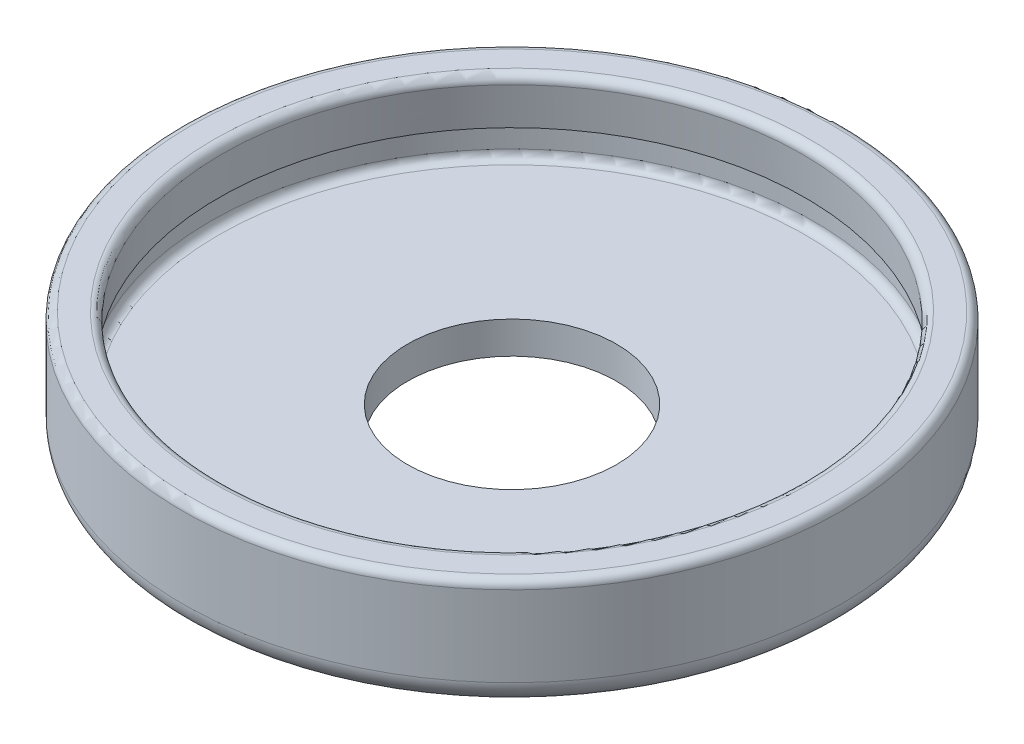
ISO-10303-21;
HEADER;
FILE_DESCRIPTION(('STEP AP214'),'2;1');
FILE_NAME('part.step','',(''),(''),'','','');
FILE_SCHEMA(('AUTOMOTIVE_DESIGN { 1 0 10303 214 1 1 1 1 }'));
ENDSEC;
DATA;
#1=APPLICATION_CONTEXT('core data for automotive mechanical design processes');
#2=APPLICATION_PROTOCOL_DEFINITION('international standard','automotive_design',2000,#1);
#3=PRODUCT_CONTEXT('',#1,'mechanical');
#4=PRODUCT('Part','Part','',(#3));
#5=PRODUCT_RELATED_PRODUCT_CATEGORY('part','',(#4));
#6=PRODUCT_DEFINITION_FORMATION('','',#4);
#7=PRODUCT_DEFINITION_CONTEXT('part definition',#1,'design');
#8=PRODUCT_DEFINITION('design','',#6,#7);
#9=PRODUCT_DEFINITION_SHAPE('','',#8);
#10=(LENGTH_UNIT() NAMED_UNIT(*) SI_UNIT(.MILLI.,.METRE.));
#11=(NAMED_UNIT(*) PLANE_ANGLE_UNIT() SI_UNIT($,.RADIAN.));
#12=(NAMED_UNIT(*) SI_UNIT($,.STERADIAN.) SOLID_ANGLE_UNIT());
#13=UNCERTAINTY_MEASURE_WITH_UNIT(LENGTH_MEASURE(1.E-05),#10,'distance_accuracy_value','');
#14=(GEOMETRIC_REPRESENTATION_CONTEXT(3) GLOBAL_UNCERTAINTY_ASSIGNED_CONTEXT((#13)) GLOBAL_UNIT_ASSIGNED_CONTEXT((#10,
#11,#12)) REPRESENTATION_CONTEXT('',''));
#15=CARTESIAN_POINT('',(0.,0.,0.));
#16=DIRECTION('',(0.,0.,1.));
#17=DIRECTION('',(1.,0.,0.));
#18=AXIS2_PLACEMENT_3D('',#15,#16,#17);
#19=CARTESIAN_POINT('',(0.,1.77799999999998,0.));
#20=DIRECTION('',(0.,1.,0.));
#21=DIRECTION('',(-1.,0.,0.));
#22=AXIS2_PLACEMENT_3D('',#19,#20,#21);
#23=PLANE('',#22);
#24=CARTESIAN_POINT('',(0.,1.77799999999998,0.));
#25=DIRECTION('',(0.,1.,0.));
#26=DIRECTION('',(-1.,0.,0.));
#27=AXIS2_PLACEMENT_3D('',#24,#25,#26);
#28=CIRCLE('',#27,5.08);
#29=CARTESIAN_POINT('',(-5.08000000000001,1.77799999999997,0.));
#30=VERTEX_POINT('',#29);
#31=EDGE_CURVE('E39',#30,#30,#28,.T.);
#32=ORIENTED_EDGE('',*,*,#31,.T.);
#33=EDGE_LOOP('',(#32));
#34=FACE_BOUND('',#33,.T.);
#35=CARTESIAN_POINT('',(0.,1.77799999999998,0.));
#36=DIRECTION('',(0.,1.,0.));
#37=DIRECTION('',(-1.,0.,0.));
#38=AXIS2_PLACEMENT_3D('',#35,#36,#37);
#39=CIRCLE('',#38,4.71002354262556);
#40=CARTESIAN_POINT('',(-4.71002354262556,1.77799999999997,0.));
#41=VERTEX_POINT('',#40);
#42=EDGE_CURVE('E43',#41,#41,#39,.F.);
#43=ORIENTED_EDGE('',*,*,#42,.T.);
#44=EDGE_LOOP('',(#43));
#45=FACE_BOUND('',#44,.T.);
#46=ADVANCED_FACE('F32',(#34,#45),#23,.T.);
#47=CARTESIAN_POINT('',(0.,1.77799999999998,0.));
#48=DIRECTION('',(0.,-1.,0.));
#49=DIRECTION('',(1.,0.,0.));
#50=AXIS2_PLACEMENT_3D('',#47,#48,#49);
#51=CONICAL_SURFACE('',#50,4.57200000000001,0.083141231888437);
#52=CARTESIAN_POINT('',(0.,1.64045322405856,0.));
#53=DIRECTION('',(0.,1.,0.));
#54=DIRECTION('',(-1.,0.,0.));
#55=AXIS2_PLACEMENT_3D('',#52,#53,#54);
#56=CIRCLE('',#55,4.58346223132846);
#57=CARTESIAN_POINT('',(-4.58346223132846,1.64045322405855,0.));
#58=VERTEX_POINT('',#57);
#59=EDGE_CURVE('E10',#58,#58,#56,.T.);
#60=ORIENTED_EDGE('',*,*,#59,.T.);
#61=EDGE_LOOP('',(#60));
#62=FACE_BOUND('',#61,.T.);
#63=CARTESIAN_POINT('',(0.,1.01599999999998,0.));
#64=DIRECTION('',(0.,-1.,0.));
#65=DIRECTION('',(1.,0.,0.));
#66=AXIS2_PLACEMENT_3D('',#63,#64,#65);
#67=CIRCLE('',#66,4.6355);
#68=CARTESIAN_POINT('',(4.6355,1.016,0.));
#69=VERTEX_POINT('',#68);
#70=EDGE_CURVE('E64',#69,#69,#67,.T.);
#71=ORIENTED_EDGE('',*,*,#70,.T.);
#72=EDGE_LOOP('',(#71));
#73=FACE_BOUND('',#72,.T.);
#74=ADVANCED_FACE('F95',(#62,#73),#51,.F.);
#75=CARTESIAN_POINT('',(0.,1.01599999999998,0.));
#76=DIRECTION('',(0.,-1.,0.));
#77=DIRECTION('',(1.,0.,0.));
#78=AXIS2_PLACEMENT_3D('',#75,#76,#77);
#79=PLANE('',#78);
#80=CARTESIAN_POINT('',(0.,1.01599999999998,0.));
#81=DIRECTION('',(0.,-1.,0.));
#82=DIRECTION('',(1.,0.,0.));
#83=AXIS2_PLACEMENT_3D('',#80,#81,#82);
#84=CIRCLE('',#83,4.7625);
#85=CARTESIAN_POINT('',(4.7625,1.016,0.));
#86=VERTEX_POINT('',#85);
#87=EDGE_CURVE('E67',#86,#86,#84,.T.);
#88=ORIENTED_EDGE('',*,*,#87,.T.);
#89=EDGE_LOOP('',(#88));
#90=FACE_BOUND('',#89,.T.);
#91=ORIENTED_EDGE('',*,*,#70,.F.);
#92=EDGE_LOOP('',(#91));
#93=FACE_BOUND('',#92,.T.);
#94=ADVANCED_FACE('F100',(#90,#93),#79,.T.);
#95=CARTESIAN_POINT('',(0.,-1.55045337728563,0.));
#96=DIRECTION('',(0.,-1.,0.));
#97=DIRECTION('',(1.,0.,0.));
#98=AXIS2_PLACEMENT_3D('',#95,#96,#97);
#99=CYLINDRICAL_SURFACE('',#98,4.7625);
#100=CARTESIAN_POINT('',(0.,0.634999999999989,0.));
#101=DIRECTION('',(0.,1.,0.));
#102=DIRECTION('',(-1.,0.,0.));
#103=AXIS2_PLACEMENT_3D('',#100,#101,#102);
#104=CIRCLE('',#103,4.7625);
#105=CARTESIAN_POINT('',(-4.76250000000001,0.634999999999972,0.));
#106=VERTEX_POINT('',#105);
#107=EDGE_CURVE('E55',#106,#106,#104,.F.);
#108=ORIENTED_EDGE('',*,*,#107,.T.);
#109=EDGE_LOOP('',(#108));
#110=FACE_BOUND('',#109,.T.);
#111=ORIENTED_EDGE('',*,*,#87,.F.);
#112=EDGE_LOOP('',(#111));
#113=FACE_BOUND('',#112,.T.);
#114=ADVANCED_FACE('F155',(#110,#113),#99,.F.);
#115=CARTESIAN_POINT('',(0.,0.507999999999989,0.));
#116=DIRECTION('',(0.,1.,0.));
#117=DIRECTION('',(-1.,0.,0.));
#118=AXIS2_PLACEMENT_3D('',#115,#116,#117);
#119=PLANE('',#118);
#120=CARTESIAN_POINT('',(0.,0.507999999999989,0.));
#121=DIRECTION('',(0.,1.,0.));
#122=DIRECTION('',(-1.,0.,0.));
#123=AXIS2_PLACEMENT_3D('',#120,#121,#122);
#124=CIRCLE('',#123,4.6355);
#125=CARTESIAN_POINT('',(-4.6355,0.507999999999972,0.));
#126=VERTEX_POINT('',#125);
#127=EDGE_CURVE('E52',#126,#126,#124,.T.);
#128=ORIENTED_EDGE('',*,*,#127,.T.);
#129=EDGE_LOOP('',(#128));
#130=FACE_BOUND('',#129,.T.);
#131=CARTESIAN_POINT('',(0.,0.507999999999994,0.));
#132=DIRECTION('',(0.,-1.,0.));
#133=DIRECTION('',(1.,0.,0.));
#134=AXIS2_PLACEMENT_3D('',#131,#132,#133);
#135=CIRCLE('',#134,1.651);
#136=CARTESIAN_POINT('',(1.651,0.508,0.));
#137=VERTEX_POINT('',#136);
#138=EDGE_CURVE('E70',#137,#137,#135,.T.);
#139=ORIENTED_EDGE('',*,*,#138,.T.);
#140=EDGE_LOOP('',(#139));
#141=FACE_BOUND('',#140,.T.);
#142=ADVANCED_FACE('F92',(#130,#141),#119,.T.);
#143=CARTESIAN_POINT('',(0.,-1.55045337728563,0.));
#144=DIRECTION('',(0.,-1.,0.));
#145=DIRECTION('',(1.,0.,0.));
#146=AXIS2_PLACEMENT_3D('',#143,#144,#145);
#147=CYLINDRICAL_SURFACE('',#146,1.651);
#148=CARTESIAN_POINT('',(0.,0.,0.));
#149=DIRECTION('',(0.,-1.,0.));
#150=DIRECTION('',(1.,0.,0.));
#151=AXIS2_PLACEMENT_3D('',#148,#149,#150);
#152=CIRCLE('',#151,1.651);
#153=CARTESIAN_POINT('',(1.651,0.,0.));
#154=VERTEX_POINT('',#153);
#155=EDGE_CURVE('E73',#154,#154,#152,.T.);
#156=ORIENTED_EDGE('',*,*,#155,.T.);
#157=EDGE_LOOP('',(#156));
#158=FACE_BOUND('',#157,.T.);
#159=ORIENTED_EDGE('',*,*,#138,.F.);
#160=EDGE_LOOP('',(#159));
#161=FACE_BOUND('',#160,.T.);
#162=ADVANCED_FACE('F77',(#158,#161),#147,.F.);
#163=CARTESIAN_POINT('',(0.,0.,0.));
#164=DIRECTION('',(0.,1.,0.));
#165=DIRECTION('',(-1.,0.,0.));
#166=AXIS2_PLACEMENT_3D('',#163,#164,#165);
#167=PLANE('',#166);
#168=CARTESIAN_POINT('',(0.,0.,0.));
#169=DIRECTION('',(0.,1.,0.));
#170=DIRECTION('',(-1.,0.,0.));
#171=AXIS2_PLACEMENT_3D('',#168,#169,#170);
#172=CIRCLE('',#171,4.826);
#173=CARTESIAN_POINT('',(-4.826,0.,0.));
#174=VERTEX_POINT('',#173);
#175=EDGE_CURVE('E61',#174,#174,#172,.F.);
#176=ORIENTED_EDGE('',*,*,#175,.T.);
#177=EDGE_LOOP('',(#176));
#178=FACE_BOUND('',#177,.T.);
#179=ORIENTED_EDGE('',*,*,#155,.F.);
#180=EDGE_LOOP('',(#179));
#181=FACE_BOUND('',#180,.T.);
#182=ADVANCED_FACE('F80',(#178,#181),#167,.F.);
#183=CARTESIAN_POINT('',(0.,-1.55045337728563,0.));
#184=DIRECTION('',(0.,-1.,0.));
#185=DIRECTION('',(1.,0.,0.));
#186=AXIS2_PLACEMENT_3D('',#183,#184,#185);
#187=CYLINDRICAL_SURFACE('',#186,5.207);
#188=CARTESIAN_POINT('',(0.,1.65099999999998,0.));
#189=DIRECTION('',(0.,1.,0.));
#190=DIRECTION('',(-1.,0.,0.));
#191=AXIS2_PLACEMENT_3D('',#188,#189,#190);
#192=CIRCLE('',#191,5.207);
#193=CARTESIAN_POINT('',(-5.20700000000001,1.65099999999996,0.));
#194=VERTEX_POINT('',#193);
#195=EDGE_CURVE('E47',#194,#194,#192,.F.);
#196=ORIENTED_EDGE('',*,*,#195,.T.);
#197=EDGE_LOOP('',(#196));
#198=FACE_BOUND('',#197,.T.);
#199=CARTESIAN_POINT('',(0.,0.380999999999988,0.));
#200=DIRECTION('',(0.,1.,0.));
#201=DIRECTION('',(-1.,0.,0.));
#202=AXIS2_PLACEMENT_3D('',#199,#200,#201);
#203=CIRCLE('',#202,5.207);
#204=CARTESIAN_POINT('',(-5.20700000000001,0.38099999999997,0.));
#205=VERTEX_POINT('',#204);
#206=EDGE_CURVE('E58',#205,#205,#203,.T.);
#207=ORIENTED_EDGE('',*,*,#206,.T.);
#208=EDGE_LOOP('',(#207));
#209=FACE_BOUND('',#208,.T.);
#210=ADVANCED_FACE('F82',(#198,#209),#187,.T.);
#211=CARTESIAN_POINT('',(0.,0.380999999999988,0.));
#212=DIRECTION('',(0.,1.,0.));
#213=DIRECTION('',(-1.,0.,0.));
#214=AXIS2_PLACEMENT_3D('',#211,#212,#213);
#215=TOROIDAL_SURFACE('',#214,4.826,0.381);
#216=ORIENTED_EDGE('',*,*,#206,.F.);
#217=EDGE_LOOP('',(#216));
#218=FACE_BOUND('',#217,.T.);
#219=ORIENTED_EDGE('',*,*,#175,.F.);
#220=EDGE_LOOP('',(#219));
#221=FACE_BOUND('',#220,.T.);
#222=ADVANCED_FACE('F89',(#218,#221),#215,.T.);
#223=CARTESIAN_POINT('',(0.,0.634999999999989,0.));
#224=DIRECTION('',(0.,1.,0.));
#225=DIRECTION('',(-1.,0.,0.));
#226=AXIS2_PLACEMENT_3D('',#223,#224,#225);
#227=TOROIDAL_SURFACE('',#226,4.6355,0.127);
#228=ORIENTED_EDGE('',*,*,#127,.F.);
#229=EDGE_LOOP('',(#228));
#230=FACE_BOUND('',#229,.T.);
#231=ORIENTED_EDGE('',*,*,#107,.F.);
#232=EDGE_LOOP('',(#231));
#233=FACE_BOUND('',#232,.T.);
#234=ADVANCED_FACE('F107',(#230,#233),#227,.F.);
#235=CARTESIAN_POINT('',(0.,1.65099999999998,0.));
#236=DIRECTION('',(0.,1.,0.));
#237=DIRECTION('',(-1.,0.,0.));
#238=AXIS2_PLACEMENT_3D('',#235,#236,#237);
#239=TOROIDAL_SURFACE('',#238,5.08,0.127);
#240=ORIENTED_EDGE('',*,*,#31,.F.);
#241=EDGE_LOOP('',(#240));
#242=FACE_BOUND('',#241,.T.);
#243=ORIENTED_EDGE('',*,*,#195,.F.);
#244=EDGE_LOOP('',(#243));
#245=FACE_BOUND('',#244,.T.);
#246=ADVANCED_FACE('F110',(#242,#245),#239,.T.);
#247=CARTESIAN_POINT('',(0.,1.65099999999998,0.));
#248=DIRECTION('',(0.,1.,0.));
#249=DIRECTION('',(-1.,0.,0.));
#250=AXIS2_PLACEMENT_3D('',#247,#248,#249);
#251=TOROIDAL_SURFACE('',#250,4.71002354262556,0.127);
#252=ORIENTED_EDGE('',*,*,#59,.F.);
#253=EDGE_LOOP('',(#252));
#254=FACE_BOUND('',#253,.T.);
#255=ORIENTED_EDGE('',*,*,#42,.F.);
#256=EDGE_LOOP('',(#255));
#257=FACE_BOUND('',#256,.T.);
#258=ADVANCED_FACE('F34',(#254,#257),#251,.T.);
#259=CLOSED_SHELL('',(#46,#74,#94,#114,#142,#162,#182,#210,#222,#234,#246,#258));
#260=MANIFOLD_SOLID_BREP('B2',#259);
#261=ADVANCED_BREP_SHAPE_REPRESENTATION('',(#18,#260),#14);
#262=SHAPE_DEFINITION_REPRESENTATION(#9,#261);
ENDSEC;
END-ISO-10303-21;
